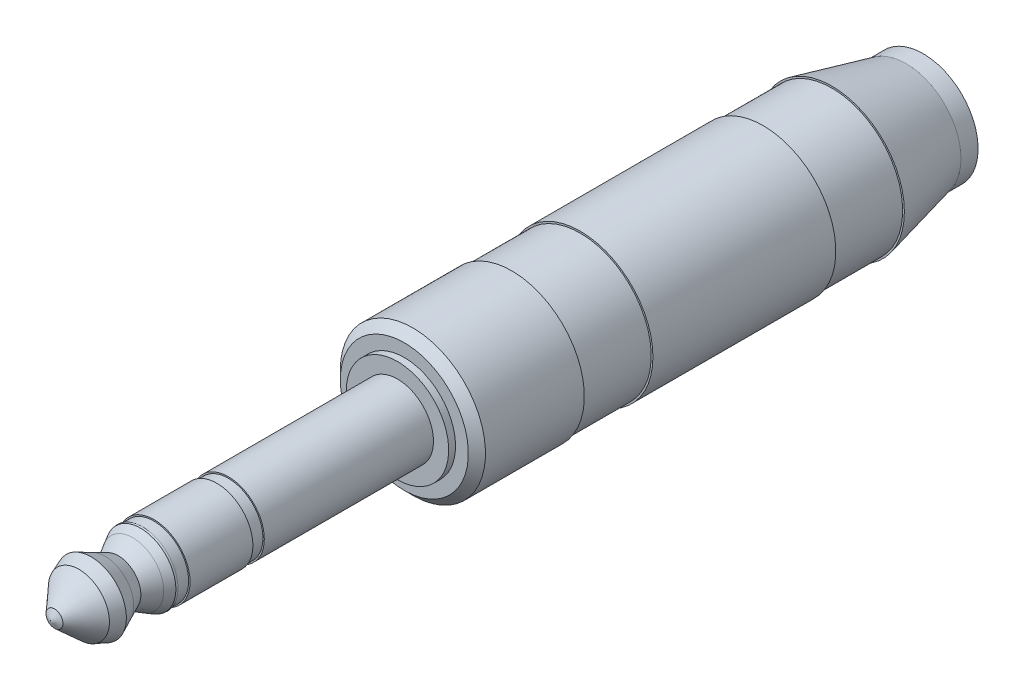
ISO-10303-21;
HEADER;
FILE_DESCRIPTION(('STEP AP214'),'2;1');
FILE_NAME('part.step','',(''),(''),'','','');
FILE_SCHEMA(('AUTOMOTIVE_DESIGN { 1 0 10303 214 1 1 1 1 }'));
ENDSEC;
DATA;
#1=APPLICATION_CONTEXT('core data for automotive mechanical design processes');
#2=APPLICATION_PROTOCOL_DEFINITION('international standard','automotive_design',2000,#1);
#3=PRODUCT_CONTEXT('',#1,'mechanical');
#4=PRODUCT('Part','Part','',(#3));
#5=PRODUCT_RELATED_PRODUCT_CATEGORY('part','',(#4));
#6=PRODUCT_DEFINITION_FORMATION('','',#4);
#7=PRODUCT_DEFINITION_CONTEXT('part definition',#1,'design');
#8=PRODUCT_DEFINITION('design','',#6,#7);
#9=PRODUCT_DEFINITION_SHAPE('','',#8);
#10=(LENGTH_UNIT() NAMED_UNIT(*) SI_UNIT(.MILLI.,.METRE.));
#11=(NAMED_UNIT(*) PLANE_ANGLE_UNIT() SI_UNIT($,.RADIAN.));
#12=(NAMED_UNIT(*) SI_UNIT($,.STERADIAN.) SOLID_ANGLE_UNIT());
#13=UNCERTAINTY_MEASURE_WITH_UNIT(LENGTH_MEASURE(1.E-05),#10,'distance_accuracy_value','');
#14=(GEOMETRIC_REPRESENTATION_CONTEXT(3) GLOBAL_UNCERTAINTY_ASSIGNED_CONTEXT((#13)) GLOBAL_UNIT_ASSIGNED_CONTEXT((#10,
#11,#12)) REPRESENTATION_CONTEXT('',''));
#15=CARTESIAN_POINT('',(0.,0.,0.));
#16=DIRECTION('',(0.,0.,1.));
#17=DIRECTION('',(1.,0.,0.));
#18=AXIS2_PLACEMENT_3D('',#15,#16,#17);
#19=CARTESIAN_POINT('',(0.,0.,-200.));
#20=DIRECTION('',(0.,0.,-1.));
#21=DIRECTION('',(-1.,0.,0.));
#22=AXIS2_PLACEMENT_3D('',#19,#20,#21);
#23=CYLINDRICAL_SURFACE('',#22,6.35);
#24=CARTESIAN_POINT('',(0.,0.,-1.34999999999999));
#25=DIRECTION('',(0.,0.,-1.));
#26=DIRECTION('',(-1.,0.,0.));
#27=AXIS2_PLACEMENT_3D('',#24,#25,#26);
#28=CIRCLE('',#27,6.35);
#29=CARTESIAN_POINT('',(-6.35,0.,-1.34999999999999));
#30=VERTEX_POINT('',#29);
#31=EDGE_CURVE('E159',#30,#30,#28,.T.);
#32=ORIENTED_EDGE('',*,*,#31,.T.);
#33=EDGE_LOOP('',(#32));
#34=FACE_BOUND('',#33,.T.);
#35=CARTESIAN_POINT('',(0.,0.,-10.));
#36=DIRECTION('',(0.,0.,-1.));
#37=DIRECTION('',(-1.,0.,0.));
#38=AXIS2_PLACEMENT_3D('',#35,#36,#37);
#39=CIRCLE('',#38,6.35);
#40=CARTESIAN_POINT('',(-6.35,0.,-10.));
#41=VERTEX_POINT('',#40);
#42=EDGE_CURVE('E109',#41,#41,#39,.T.);
#43=ORIENTED_EDGE('',*,*,#42,.F.);
#44=EDGE_LOOP('',(#43));
#45=FACE_BOUND('',#44,.T.);
#46=ADVANCED_FACE('F45',(#34,#45),#23,.T.);
#47=CARTESIAN_POINT('',(0.,0.,-200.));
#48=DIRECTION('',(0.,0.,-1.));
#49=DIRECTION('',(-1.,0.,0.));
#50=AXIS2_PLACEMENT_3D('',#47,#48,#49);
#51=CYLINDRICAL_SURFACE('',#50,3.15);
#52=CARTESIAN_POINT('',(0.,0.,0.));
#53=DIRECTION('',(0.,0.,-1.));
#54=DIRECTION('',(-1.,0.,0.));
#55=AXIS2_PLACEMENT_3D('',#52,#53,#54);
#56=CIRCLE('',#55,3.15);
#57=CARTESIAN_POINT('',(-3.15,0.,0.));
#58=VERTEX_POINT('',#57);
#59=EDGE_CURVE('E147',#58,#58,#56,.T.);
#60=ORIENTED_EDGE('',*,*,#59,.F.);
#61=EDGE_LOOP('',(#60));
#62=FACE_BOUND('',#61,.T.);
#63=CARTESIAN_POINT('',(0.,0.,14.8));
#64=DIRECTION('',(0.,0.,1.));
#65=DIRECTION('',(1.,0.,0.));
#66=AXIS2_PLACEMENT_3D('',#63,#64,#65);
#67=CIRCLE('',#66,3.15);
#68=CARTESIAN_POINT('',(3.15,0.,14.8));
#69=VERTEX_POINT('',#68);
#70=EDGE_CURVE('E123',#69,#69,#67,.T.);
#71=ORIENTED_EDGE('',*,*,#70,.F.);
#72=EDGE_LOOP('',(#71));
#73=FACE_BOUND('',#72,.T.);
#74=ADVANCED_FACE('F72',(#62,#73),#51,.T.);
#75=CARTESIAN_POINT('',(3.15,0.,0.));
#76=DIRECTION('',(0.,0.,-1.));
#77=DIRECTION('',(-1.,0.,0.));
#78=AXIS2_PLACEMENT_3D('',#75,#76,#77);
#79=PLANE('',#78);
#80=CARTESIAN_POINT('',(0.,0.,0.));
#81=DIRECTION('',(0.,0.,-1.));
#82=DIRECTION('',(-1.,0.,0.));
#83=AXIS2_PLACEMENT_3D('',#80,#81,#82);
#84=CIRCLE('',#83,4.48);
#85=CARTESIAN_POINT('',(-4.48,0.,0.));
#86=VERTEX_POINT('',#85);
#87=EDGE_CURVE('E150',#86,#86,#84,.T.);
#88=ORIENTED_EDGE('',*,*,#87,.F.);
#89=EDGE_LOOP('',(#88));
#90=FACE_BOUND('',#89,.T.);
#91=ORIENTED_EDGE('',*,*,#59,.T.);
#92=EDGE_LOOP('',(#91));
#93=FACE_BOUND('',#92,.T.);
#94=ADVANCED_FACE('F79',(#90,#93),#79,.F.);
#95=CARTESIAN_POINT('',(0.,0.,-200.));
#96=DIRECTION('',(0.,0.,-1.));
#97=DIRECTION('',(-1.,0.,0.));
#98=AXIS2_PLACEMENT_3D('',#95,#96,#97);
#99=CYLINDRICAL_SURFACE('',#98,4.48);
#100=CARTESIAN_POINT('',(0.,0.,-0.599999999999989));
#101=DIRECTION('',(0.,0.,-1.));
#102=DIRECTION('',(-1.,0.,0.));
#103=AXIS2_PLACEMENT_3D('',#100,#101,#102);
#104=CIRCLE('',#103,4.48);
#105=CARTESIAN_POINT('',(-4.48,0.,-0.599999999999989));
#106=VERTEX_POINT('',#105);
#107=EDGE_CURVE('E153',#106,#106,#104,.T.);
#108=ORIENTED_EDGE('',*,*,#107,.F.);
#109=EDGE_LOOP('',(#108));
#110=FACE_BOUND('',#109,.T.);
#111=ORIENTED_EDGE('',*,*,#87,.T.);
#112=EDGE_LOOP('',(#111));
#113=FACE_BOUND('',#112,.T.);
#114=ADVANCED_FACE('F548',(#110,#113),#99,.T.);
#115=CARTESIAN_POINT('',(4.48,0.,-0.6));
#116=DIRECTION('',(0.,0.,-1.));
#117=DIRECTION('',(-1.,0.,0.));
#118=AXIS2_PLACEMENT_3D('',#115,#116,#117);
#119=PLANE('',#118);
#120=CARTESIAN_POINT('',(0.,0.,-0.599999999999989));
#121=DIRECTION('',(0.,0.,-1.));
#122=DIRECTION('',(-1.,0.,0.));
#123=AXIS2_PLACEMENT_3D('',#120,#121,#122);
#124=CIRCLE('',#123,5.6);
#125=CARTESIAN_POINT('',(-5.6,0.,-0.599999999999989));
#126=VERTEX_POINT('',#125);
#127=EDGE_CURVE('E156',#126,#126,#124,.T.);
#128=ORIENTED_EDGE('',*,*,#127,.F.);
#129=EDGE_LOOP('',(#128));
#130=FACE_BOUND('',#129,.T.);
#131=ORIENTED_EDGE('',*,*,#107,.T.);
#132=EDGE_LOOP('',(#131));
#133=FACE_BOUND('',#132,.T.);
#134=ADVANCED_FACE('F539',(#130,#133),#119,.F.);
#135=CARTESIAN_POINT('',(0.,0.,-0.599999999999989));
#136=DIRECTION('',(0.,0.,-1.));
#137=DIRECTION('',(-1.,0.,0.));
#138=AXIS2_PLACEMENT_3D('',#135,#136,#137);
#139=CONICAL_SURFACE('',#138,5.6,0.785398163397448);
#140=ORIENTED_EDGE('',*,*,#31,.F.);
#141=EDGE_LOOP('',(#140));
#142=FACE_BOUND('',#141,.T.);
#143=ORIENTED_EDGE('',*,*,#127,.T.);
#144=EDGE_LOOP('',(#143));
#145=FACE_BOUND('',#144,.T.);
#146=ADVANCED_FACE('F242',(#142,#145),#139,.T.);
#147=CARTESIAN_POINT('',(3.03,0.,14.8));
#148=DIRECTION('',(0.,0.,1.));
#149=DIRECTION('',(1.,0.,0.));
#150=AXIS2_PLACEMENT_3D('',#147,#148,#149);
#151=PLANE('',#150);
#152=CARTESIAN_POINT('',(0.,0.,14.8));
#153=DIRECTION('',(0.,0.,-1.));
#154=DIRECTION('',(-1.,0.,0.));
#155=AXIS2_PLACEMENT_3D('',#152,#153,#154);
#156=CIRCLE('',#155,3.03);
#157=CARTESIAN_POINT('',(-3.03,0.,14.8));
#158=VERTEX_POINT('',#157);
#159=EDGE_CURVE('E166',#158,#158,#156,.T.);
#160=ORIENTED_EDGE('',*,*,#159,.T.);
#161=EDGE_LOOP('',(#160));
#162=FACE_BOUND('',#161,.T.);
#163=ORIENTED_EDGE('',*,*,#70,.T.);
#164=EDGE_LOOP('',(#163));
#165=FACE_BOUND('',#164,.T.);
#166=ADVANCED_FACE('F238',(#162,#165),#151,.T.);
#167=CARTESIAN_POINT('',(3.4,0.,15.8));
#168=DIRECTION('',(0.,0.,-1.));
#169=DIRECTION('',(-1.,0.,0.));
#170=AXIS2_PLACEMENT_3D('',#167,#168,#169);
#171=PLANE('',#170);
#172=CARTESIAN_POINT('',(0.,0.,15.8));
#173=DIRECTION('',(0.,0.,-1.));
#174=DIRECTION('',(-1.,0.,0.));
#175=AXIS2_PLACEMENT_3D('',#172,#173,#174);
#176=CIRCLE('',#175,3.03);
#177=CARTESIAN_POINT('',(-3.03,0.,15.8));
#178=VERTEX_POINT('',#177);
#179=EDGE_CURVE('E112',#178,#178,#176,.T.);
#180=ORIENTED_EDGE('',*,*,#179,.F.);
#181=EDGE_LOOP('',(#180));
#182=FACE_BOUND('',#181,.T.);
#183=CARTESIAN_POINT('',(0.,0.,15.8));
#184=DIRECTION('',(0.,0.,-1.));
#185=DIRECTION('',(-1.,0.,0.));
#186=AXIS2_PLACEMENT_3D('',#183,#184,#185);
#187=CIRCLE('',#186,3.15);
#188=CARTESIAN_POINT('',(-3.15,0.,15.8));
#189=VERTEX_POINT('',#188);
#190=EDGE_CURVE('E126',#189,#189,#187,.T.);
#191=ORIENTED_EDGE('',*,*,#190,.T.);
#192=EDGE_LOOP('',(#191));
#193=FACE_BOUND('',#192,.T.);
#194=ADVANCED_FACE('F234',(#182,#193),#171,.T.);
#195=CARTESIAN_POINT('',(0.,0.,-200.));
#196=DIRECTION('',(0.,0.,-1.));
#197=DIRECTION('',(-1.,0.,0.));
#198=AXIS2_PLACEMENT_3D('',#195,#196,#197);
#199=CYLINDRICAL_SURFACE('',#198,3.03);
#200=ORIENTED_EDGE('',*,*,#179,.T.);
#201=EDGE_LOOP('',(#200));
#202=FACE_BOUND('',#201,.T.);
#203=ORIENTED_EDGE('',*,*,#159,.F.);
#204=EDGE_LOOP('',(#203));
#205=FACE_BOUND('',#204,.T.);
#206=ADVANCED_FACE('F237',(#202,#205),#199,.T.);
#207=ORIENTED_EDGE('',*,*,#190,.F.);
#208=EDGE_LOOP('',(#207));
#209=FACE_BOUND('',#208,.T.);
#210=CARTESIAN_POINT('',(0.,0.,21.3));
#211=DIRECTION('',(0.,0.,1.));
#212=DIRECTION('',(1.,0.,0.));
#213=AXIS2_PLACEMENT_3D('',#210,#211,#212);
#214=CIRCLE('',#213,3.15);
#215=CARTESIAN_POINT('',(3.15,0.,21.3));
#216=VERTEX_POINT('',#215);
#217=EDGE_CURVE('E120',#216,#216,#214,.T.);
#218=ORIENTED_EDGE('',*,*,#217,.F.);
#219=EDGE_LOOP('',(#218));
#220=FACE_BOUND('',#219,.T.);
#221=ADVANCED_FACE('F82',(#209,#220),#51,.T.);
#222=CARTESIAN_POINT('',(3.4,0.,22.3));
#223=DIRECTION('',(0.,0.,-1.));
#224=DIRECTION('',(-1.,0.,0.));
#225=AXIS2_PLACEMENT_3D('',#222,#223,#224);
#226=PLANE('',#225);
#227=CARTESIAN_POINT('',(0.,0.,22.3));
#228=DIRECTION('',(0.,0.,-1.));
#229=DIRECTION('',(-1.,0.,0.));
#230=AXIS2_PLACEMENT_3D('',#227,#228,#229);
#231=CIRCLE('',#230,3.03);
#232=CARTESIAN_POINT('',(-3.03,0.,22.3));
#233=VERTEX_POINT('',#232);
#234=EDGE_CURVE('E169',#233,#233,#231,.T.);
#235=ORIENTED_EDGE('',*,*,#234,.F.);
#236=EDGE_LOOP('',(#235));
#237=FACE_BOUND('',#236,.T.);
#238=CARTESIAN_POINT('',(0.,0.,22.3));
#239=DIRECTION('',(0.,0.,-1.));
#240=DIRECTION('',(-1.,0.,0.));
#241=AXIS2_PLACEMENT_3D('',#238,#239,#240);
#242=CIRCLE('',#241,3.09888888888889);
#243=CARTESIAN_POINT('',(-3.09888888888889,0.,22.3));
#244=VERTEX_POINT('',#243);
#245=EDGE_CURVE('E116',#244,#244,#242,.T.);
#246=ORIENTED_EDGE('',*,*,#245,.T.);
#247=EDGE_LOOP('',(#246));
#248=FACE_BOUND('',#247,.T.);
#249=ADVANCED_FACE('F227',(#237,#248),#226,.T.);
#250=CARTESIAN_POINT('',(3.03,0.,21.3));
#251=DIRECTION('',(0.,0.,1.));
#252=DIRECTION('',(1.,0.,0.));
#253=AXIS2_PLACEMENT_3D('',#250,#251,#252);
#254=PLANE('',#253);
#255=CARTESIAN_POINT('',(0.,0.,21.3));
#256=DIRECTION('',(0.,0.,-1.));
#257=DIRECTION('',(-1.,0.,0.));
#258=AXIS2_PLACEMENT_3D('',#255,#256,#257);
#259=CIRCLE('',#258,3.03);
#260=CARTESIAN_POINT('',(-3.03,0.,21.3));
#261=VERTEX_POINT('',#260);
#262=EDGE_CURVE('E128',#261,#261,#259,.T.);
#263=ORIENTED_EDGE('',*,*,#262,.T.);
#264=EDGE_LOOP('',(#263));
#265=FACE_BOUND('',#264,.T.);
#266=ORIENTED_EDGE('',*,*,#217,.T.);
#267=EDGE_LOOP('',(#266));
#268=FACE_BOUND('',#267,.T.);
#269=ADVANCED_FACE('F67',(#265,#268),#254,.T.);
#270=CARTESIAN_POINT('',(0.,0.,-200.));
#271=DIRECTION('',(0.,0.,-1.));
#272=DIRECTION('',(-1.,0.,0.));
#273=AXIS2_PLACEMENT_3D('',#270,#271,#272);
#274=CYLINDRICAL_SURFACE('',#273,3.03);
#275=ORIENTED_EDGE('',*,*,#234,.T.);
#276=EDGE_LOOP('',(#275));
#277=FACE_BOUND('',#276,.T.);
#278=ORIENTED_EDGE('',*,*,#262,.F.);
#279=EDGE_LOOP('',(#278));
#280=FACE_BOUND('',#279,.T.);
#281=ADVANCED_FACE('F59',(#277,#280),#274,.T.);
#282=CARTESIAN_POINT('',(0.,0.,30.34));
#283=DIRECTION('',(0.,0.,-1.));
#284=DIRECTION('',(-1.,0.,0.));
#285=AXIS2_PLACEMENT_3D('',#282,#283,#284);
#286=CONICAL_SURFACE('',#285,0.,1.15131886503954);
#287=CARTESIAN_POINT('',(0.,0.,30.01));
#288=DIRECTION('',(0.,0.,-1.));
#289=DIRECTION('',(-1.,0.,0.));
#290=AXIS2_PLACEMENT_3D('',#287,#288,#289);
#291=CIRCLE('',#290,0.74);
#292=CARTESIAN_POINT('',(-0.739999999999998,0.,30.01));
#293=VERTEX_POINT('',#292);
#294=EDGE_CURVE('E11',#293,#293,#291,.T.);
#295=ORIENTED_EDGE('',*,*,#294,.F.);
#296=EDGE_LOOP('',(#295));
#297=FACE_BOUND('',#296,.T.);
#298=CARTESIAN_POINT('',(0.,0.,30.34));
#299=VERTEX_POINT('',#298);
#300=VERTEX_LOOP('',#299);
#301=FACE_BOUND('',#300,.T.);
#302=ADVANCED_FACE('F47',(#297,#301),#286,.T.);
#303=CARTESIAN_POINT('',(0.,0.,30.01));
#304=DIRECTION('',(0.,0.,-1.));
#305=DIRECTION('',(-1.,0.,0.));
#306=AXIS2_PLACEMENT_3D('',#303,#304,#305);
#307=CONICAL_SURFACE('',#306,0.74,0.733846826981431);
#308=CARTESIAN_POINT('',(0.,0.,27.87));
#309=DIRECTION('',(0.,0.,-1.));
#310=DIRECTION('',(-1.,0.,0.));
#311=AXIS2_PLACEMENT_3D('',#308,#309,#310);
#312=CIRCLE('',#311,2.67);
#313=CARTESIAN_POINT('',(-2.67,0.,27.87));
#314=VERTEX_POINT('',#313);
#315=EDGE_CURVE('E53',#314,#314,#312,.T.);
#316=CARTESIAN_POINT('',(-2.67,0.,27.87));
#317=CARTESIAN_POINT('',(-2.64989583333333,0.,27.8922916666667));
#318=CARTESIAN_POINT('',(-2.62979166666666,0.,27.9145833333333));
#319=CARTESIAN_POINT('',(-2.58958333333333,0.,27.9591666666667));
#320=CARTESIAN_POINT('',(-2.56947916666667,0.,27.9814583333333));
#321=CARTESIAN_POINT('',(-2.52927083333333,0.,28.0260416666667));
#322=CARTESIAN_POINT('',(-2.50916666666666,0.,28.0483333333333));
#323=CARTESIAN_POINT('',(-2.46895833333333,0.,28.0929166666667));
#324=CARTESIAN_POINT('',(-2.44885416666667,0.,28.1152083333333));
#325=CARTESIAN_POINT('',(-2.40864583333333,0.,28.1597916666667));
#326=CARTESIAN_POINT('',(-2.38854166666667,0.,28.1820833333333));
#327=CARTESIAN_POINT('',(-2.34833333333333,0.,28.2266666666667));
#328=CARTESIAN_POINT('',(-2.32822916666667,0.,28.2489583333333));
#329=CARTESIAN_POINT('',(-2.28802083333333,0.,28.2935416666667));
#330=CARTESIAN_POINT('',(-2.26791666666667,0.,28.3158333333333));
#331=CARTESIAN_POINT('',(-2.22770833333333,0.,28.3604166666667));
#332=CARTESIAN_POINT('',(-2.20760416666666,0.,28.3827083333333));
#333=CARTESIAN_POINT('',(-2.16739583333333,0.,28.4272916666667));
#334=CARTESIAN_POINT('',(-2.14729166666667,0.,28.4495833333333));
#335=CARTESIAN_POINT('',(-2.10708333333333,0.,28.4941666666667));
#336=CARTESIAN_POINT('',(-2.08697916666667,0.,28.5164583333333));
#337=CARTESIAN_POINT('',(-2.04677083333333,0.,28.5610416666667));
#338=CARTESIAN_POINT('',(-2.02666666666667,0.,28.5833333333333));
#339=CARTESIAN_POINT('',(-1.98645833333333,0.,28.6279166666667));
#340=CARTESIAN_POINT('',(-1.96635416666667,0.,28.6502083333333));
#341=CARTESIAN_POINT('',(-1.92614583333333,0.,28.6947916666667));
#342=CARTESIAN_POINT('',(-1.90604166666667,0.,28.7170833333333));
#343=CARTESIAN_POINT('',(-1.86583333333333,0.,28.7616666666667));
#344=CARTESIAN_POINT('',(-1.84572916666667,0.,28.7839583333333));
#345=CARTESIAN_POINT('',(-1.80552083333333,0.,28.8285416666667));
#346=CARTESIAN_POINT('',(-1.78541666666667,0.,28.8508333333333));
#347=CARTESIAN_POINT('',(-1.74520833333333,0.,28.8954166666667));
#348=CARTESIAN_POINT('',(-1.72510416666666,0.,28.9177083333333));
#349=CARTESIAN_POINT('',(-1.68489583333333,0.,28.9622916666667));
#350=CARTESIAN_POINT('',(-1.66479166666667,0.,28.9845833333333));
#351=CARTESIAN_POINT('',(-1.62458333333333,0.,29.0291666666667));
#352=CARTESIAN_POINT('',(-1.60447916666667,0.,29.0514583333333));
#353=CARTESIAN_POINT('',(-1.56427083333333,0.,29.0960416666667));
#354=CARTESIAN_POINT('',(-1.54416666666667,0.,29.1183333333333));
#355=CARTESIAN_POINT('',(-1.50395833333333,0.,29.1629166666667));
#356=CARTESIAN_POINT('',(-1.48385416666667,0.,29.1852083333333));
#357=CARTESIAN_POINT('',(-1.44364583333333,0.,29.2297916666667));
#358=CARTESIAN_POINT('',(-1.42354166666666,0.,29.2520833333333));
#359=CARTESIAN_POINT('',(-1.38333333333333,0.,29.2966666666667));
#360=CARTESIAN_POINT('',(-1.36322916666666,0.,29.3189583333333));
#361=CARTESIAN_POINT('',(-1.32302083333333,0.,29.3635416666667));
#362=CARTESIAN_POINT('',(-1.30291666666667,0.,29.3858333333333));
#363=CARTESIAN_POINT('',(-1.26270833333333,0.,29.4304166666667));
#364=CARTESIAN_POINT('',(-1.24260416666666,0.,29.4527083333333));
#365=CARTESIAN_POINT('',(-1.20239583333333,0.,29.4972916666667));
#366=CARTESIAN_POINT('',(-1.18229166666666,0.,29.5195833333333));
#367=CARTESIAN_POINT('',(-1.14208333333333,0.,29.5641666666667));
#368=CARTESIAN_POINT('',(-1.12197916666667,0.,29.5864583333333));
#369=CARTESIAN_POINT('',(-1.08177083333333,0.,29.6310416666667));
#370=CARTESIAN_POINT('',(-1.06166666666666,0.,29.6533333333333));
#371=CARTESIAN_POINT('',(-1.02145833333333,0.,29.6979166666667));
#372=CARTESIAN_POINT('',(-1.00135416666667,0.,29.7202083333333));
#373=CARTESIAN_POINT('',(-0.961145833333332,0.,29.7647916666667));
#374=CARTESIAN_POINT('',(-0.941041666666665,0.,29.7870833333333));
#375=CARTESIAN_POINT('',(-0.900833333333331,0.,29.8316666666667));
#376=CARTESIAN_POINT('',(-0.880729166666665,0.,29.8539583333333));
#377=CARTESIAN_POINT('',(-0.840520833333332,0.,29.8985416666667));
#378=CARTESIAN_POINT('',(-0.820416666666665,0.,29.9208333333333));
#379=CARTESIAN_POINT('',(-0.780208333333332,0.,29.9654166666667));
#380=CARTESIAN_POINT('',(-0.760104166666666,0.,29.9877083333333));
#381=CARTESIAN_POINT('',(-0.739999999999998,0.,30.01));
#382=B_SPLINE_CURVE_WITH_KNOTS('',3,(#316,#317,#318,#319,#320,#321,#322,#323,#324,#325,#326,
#327,#328,#329,#330,#331,#332,#333,#334,#335,#336,#337,#338,#339,#340,#341,#342,#343,#344,#345,
#346,#347,#348,#349,#350,#351,#352,#353,#354,#355,#356,#357,#358,#359,#360,#361,#362,#363,#364,
#365,#366,#367,#368,#369,#370,#371,#372,#373,#374,#375,#376,#377,#378,#379,#380,#381),
.UNSPECIFIED.,.F.,.F.,(4,2,2,2,2,2,2,2,2,2,2,2,2,2,2,2,2,2,2,2,2,2,2,2,2,2,2,2,2,2,2,2,4),(0.,
0.0900547793359696,0.180109558671939,0.270164338007908,0.360219117343877,0.450273896679844,
0.540328676015813,0.630383455351783,0.72043823468775,0.810493014023719,0.900547793359688,
0.990602572695657,1.08065735203163,1.17071213136759,1.26076691070356,1.35082169003953,
1.4408764693755,1.53093124871147,1.62098602804744,1.71104080738341,1.80109558671938,
1.89115036605534,1.98120514539131,2.07125992472728,2.16131470406325,2.25136948339922,
2.34142426273519,2.43147904207116,2.52153382140713,2.61158860074309,2.70164338007906,
2.79169815941503,2.881752938751),.UNSPECIFIED.);
#383=EDGE_CURVE('BSEAM58',#314,#293,#382,.T.);
#384=ORIENTED_EDGE('',*,*,#315,.F.);
#385=ORIENTED_EDGE('',*,*,#294,.T.);
#386=ORIENTED_EDGE('',*,*,#383,.T.);
#387=ORIENTED_EDGE('',*,*,#383,.F.);
#388=EDGE_LOOP('',(#384,#386,#385,#387));
#389=FACE_BOUND('',#388,.T.);
#390=ADVANCED_FACE('F58',(#389),#307,.T.);
#391=CARTESIAN_POINT('',(0.,0.,27.87));
#392=DIRECTION('',(0.,0.,-1.));
#393=DIRECTION('',(-1.,0.,0.));
#394=AXIS2_PLACEMENT_3D('',#391,#392,#393);
#395=CONICAL_SURFACE('',#394,2.67,0.365920701642083);
#396=CARTESIAN_POINT('',(0.,0.,26.8));
#397=DIRECTION('',(0.,0.,-1.));
#398=DIRECTION('',(-1.,0.,0.));
#399=AXIS2_PLACEMENT_3D('',#396,#397,#398);
#400=CIRCLE('',#399,3.08);
#401=CARTESIAN_POINT('',(-3.08,0.,26.8));
#402=VERTEX_POINT('',#401);
#403=EDGE_CURVE('E132',#402,#402,#400,.T.);
#404=ORIENTED_EDGE('',*,*,#403,.F.);
#405=EDGE_LOOP('',(#404));
#406=FACE_BOUND('',#405,.T.);
#407=ORIENTED_EDGE('',*,*,#315,.T.);
#408=EDGE_LOOP('',(#407));
#409=FACE_BOUND('',#408,.T.);
#410=ADVANCED_FACE('F65',(#406,#409),#395,.T.);
#411=CARTESIAN_POINT('',(0.,0.,26.8));
#412=DIRECTION('',(0.,0.,1.));
#413=DIRECTION('',(1.,0.,0.));
#414=AXIS2_PLACEMENT_3D('',#411,#412,#413);
#415=CONICAL_SURFACE('',#414,3.08,0.43707579145684);
#416=CARTESIAN_POINT('',(0.,0.,25.58));
#417=DIRECTION('',(0.,0.,-1.));
#418=DIRECTION('',(-1.,0.,0.));
#419=AXIS2_PLACEMENT_3D('',#416,#417,#418);
#420=CIRCLE('',#419,2.51);
#421=CARTESIAN_POINT('',(-2.51,0.,25.58));
#422=VERTEX_POINT('',#421);
#423=EDGE_CURVE('E135',#422,#422,#420,.T.);
#424=ORIENTED_EDGE('',*,*,#423,.F.);
#425=EDGE_LOOP('',(#424));
#426=FACE_BOUND('',#425,.T.);
#427=ORIENTED_EDGE('',*,*,#403,.T.);
#428=EDGE_LOOP('',(#427));
#429=FACE_BOUND('',#428,.T.);
#430=ADVANCED_FACE('F282',(#426,#429),#415,.T.);
#431=CARTESIAN_POINT('',(0.,0.,25.58));
#432=DIRECTION('',(0.,0.,1.));
#433=DIRECTION('',(1.,0.,0.));
#434=AXIS2_PLACEMENT_3D('',#431,#432,#433);
#435=CONICAL_SURFACE('',#434,2.51,0.431856203646335);
#436=CARTESIAN_POINT('',(0.,0.,24.43));
#437=DIRECTION('',(0.,0.,-1.));
#438=DIRECTION('',(-1.,0.,0.));
#439=AXIS2_PLACEMENT_3D('',#436,#437,#438);
#440=CIRCLE('',#439,1.98);
#441=CARTESIAN_POINT('',(-1.98,0.,24.43));
#442=VERTEX_POINT('',#441);
#443=EDGE_CURVE('E138',#442,#442,#440,.T.);
#444=ORIENTED_EDGE('',*,*,#443,.F.);
#445=EDGE_LOOP('',(#444));
#446=FACE_BOUND('',#445,.T.);
#447=ORIENTED_EDGE('',*,*,#423,.T.);
#448=EDGE_LOOP('',(#447));
#449=FACE_BOUND('',#448,.T.);
#450=ADVANCED_FACE('F278',(#446,#449),#435,.T.);
#451=CARTESIAN_POINT('',(0.,0.,24.43));
#452=DIRECTION('',(0.,0.,-1.));
#453=DIRECTION('',(-1.,0.,0.));
#454=AXIS2_PLACEMENT_3D('',#451,#452,#453);
#455=CONICAL_SURFACE('',#454,1.98,0.512389460310737);
#456=CARTESIAN_POINT('',(0.,0.,23.15));
#457=DIRECTION('',(0.,0.,-1.));
#458=DIRECTION('',(-1.,0.,0.));
#459=AXIS2_PLACEMENT_3D('',#456,#457,#458);
#460=CIRCLE('',#459,2.7);
#461=CARTESIAN_POINT('',(-2.7,0.,23.15));
#462=VERTEX_POINT('',#461);
#463=EDGE_CURVE('E141',#462,#462,#460,.T.);
#464=ORIENTED_EDGE('',*,*,#463,.F.);
#465=EDGE_LOOP('',(#464));
#466=FACE_BOUND('',#465,.T.);
#467=ORIENTED_EDGE('',*,*,#443,.T.);
#468=EDGE_LOOP('',(#467));
#469=FACE_BOUND('',#468,.T.);
#470=ADVANCED_FACE('F274',(#466,#469),#455,.T.);
#471=CARTESIAN_POINT('',(0.,0.,23.15));
#472=DIRECTION('',(0.,0.,-1.));
#473=DIRECTION('',(-1.,0.,0.));
#474=AXIS2_PLACEMENT_3D('',#471,#472,#473);
#475=CONICAL_SURFACE('',#474,2.7,0.509592264808917);
#476=CARTESIAN_POINT('',(0.,0.,22.47));
#477=DIRECTION('',(0.,0.,-1.));
#478=DIRECTION('',(-1.,0.,0.));
#479=AXIS2_PLACEMENT_3D('',#476,#477,#478);
#480=CIRCLE('',#479,3.08);
#481=CARTESIAN_POINT('',(-3.08,0.,22.47));
#482=VERTEX_POINT('',#481);
#483=EDGE_CURVE('E144',#482,#482,#480,.T.);
#484=ORIENTED_EDGE('',*,*,#483,.F.);
#485=EDGE_LOOP('',(#484));
#486=FACE_BOUND('',#485,.T.);
#487=ORIENTED_EDGE('',*,*,#463,.T.);
#488=EDGE_LOOP('',(#487));
#489=FACE_BOUND('',#488,.T.);
#490=ADVANCED_FACE('F270',(#486,#489),#475,.T.);
#491=CARTESIAN_POINT('',(0.,0.,22.47));
#492=DIRECTION('',(0.,0.,-1.));
#493=DIRECTION('',(-1.,0.,0.));
#494=AXIS2_PLACEMENT_3D('',#491,#492,#493);
#495=CONICAL_SURFACE('',#494,3.08,0.110657221173897);
#496=ORIENTED_EDGE('',*,*,#483,.T.);
#497=EDGE_LOOP('',(#496));
#498=FACE_BOUND('',#497,.T.);
#499=ORIENTED_EDGE('',*,*,#245,.F.);
#500=EDGE_LOOP('',(#499));
#501=FACE_BOUND('',#500,.T.);
#502=ADVANCED_FACE('F266',(#498,#501),#495,.T.);
#503=CARTESIAN_POINT('',(6.2,0.,-10.));
#504=DIRECTION('',(0.,0.,-1.));
#505=DIRECTION('',(-1.,0.,0.));
#506=AXIS2_PLACEMENT_3D('',#503,#504,#505);
#507=PLANE('',#506);
#508=CARTESIAN_POINT('',(0.,0.,-10.));
#509=DIRECTION('',(0.,0.,-1.));
#510=DIRECTION('',(-1.,0.,0.));
#511=AXIS2_PLACEMENT_3D('',#508,#509,#510);
#512=CIRCLE('',#511,6.2);
#513=CARTESIAN_POINT('',(-6.2,0.,-10.));
#514=VERTEX_POINT('',#513);
#515=EDGE_CURVE('E178',#514,#514,#512,.T.);
#516=ORIENTED_EDGE('',*,*,#515,.F.);
#517=EDGE_LOOP('',(#516));
#518=FACE_BOUND('',#517,.T.);
#519=ORIENTED_EDGE('',*,*,#42,.T.);
#520=EDGE_LOOP('',(#519));
#521=FACE_BOUND('',#520,.T.);
#522=ADVANCED_FACE('F269',(#518,#521),#507,.T.);
#523=CARTESIAN_POINT('',(6.6,0.,-16.));
#524=DIRECTION('',(0.,0.,1.));
#525=DIRECTION('',(1.,0.,0.));
#526=AXIS2_PLACEMENT_3D('',#523,#524,#525);
#527=PLANE('',#526);
#528=CARTESIAN_POINT('',(0.,0.,-16.));
#529=DIRECTION('',(0.,0.,-1.));
#530=DIRECTION('',(-1.,0.,0.));
#531=AXIS2_PLACEMENT_3D('',#528,#529,#530);
#532=CIRCLE('',#531,6.2);
#533=CARTESIAN_POINT('',(-6.2,0.,-16.));
#534=VERTEX_POINT('',#533);
#535=EDGE_CURVE('E182',#534,#534,#532,.T.);
#536=ORIENTED_EDGE('',*,*,#535,.T.);
#537=EDGE_LOOP('',(#536));
#538=FACE_BOUND('',#537,.T.);
#539=CARTESIAN_POINT('',(0.,0.,-16.));
#540=DIRECTION('',(0.,0.,1.));
#541=DIRECTION('',(1.,0.,0.));
#542=AXIS2_PLACEMENT_3D('',#539,#540,#541);
#543=CIRCLE('',#542,6.35);
#544=CARTESIAN_POINT('',(6.35,0.,-16.));
#545=VERTEX_POINT('',#544);
#546=EDGE_CURVE('E107',#545,#545,#543,.T.);
#547=ORIENTED_EDGE('',*,*,#546,.T.);
#548=EDGE_LOOP('',(#547));
#549=FACE_BOUND('',#548,.T.);
#550=ADVANCED_FACE('F98',(#538,#549),#527,.T.);
#551=CARTESIAN_POINT('',(0.,0.,-200.));
#552=DIRECTION('',(0.,0.,-1.));
#553=DIRECTION('',(-1.,0.,0.));
#554=AXIS2_PLACEMENT_3D('',#551,#552,#553);
#555=CYLINDRICAL_SURFACE('',#554,6.2);
#556=ORIENTED_EDGE('',*,*,#515,.T.);
#557=EDGE_LOOP('',(#556));
#558=FACE_BOUND('',#557,.T.);
#559=ORIENTED_EDGE('',*,*,#535,.F.);
#560=EDGE_LOOP('',(#559));
#561=FACE_BOUND('',#560,.T.);
#562=ADVANCED_FACE('F89',(#558,#561),#555,.T.);
#563=CARTESIAN_POINT('',(0.,0.,-32.));
#564=DIRECTION('',(0.,0.,-1.));
#565=DIRECTION('',(-1.,0.,0.));
#566=AXIS2_PLACEMENT_3D('',#563,#564,#565);
#567=CIRCLE('',#566,6.35);
#568=CARTESIAN_POINT('',(-6.35,0.,-32.));
#569=VERTEX_POINT('',#568);
#570=EDGE_CURVE('E104',#569,#569,#567,.T.);
#571=ORIENTED_EDGE('',*,*,#570,.F.);
#572=EDGE_LOOP('',(#571));
#573=FACE_BOUND('',#572,.T.);
#574=ORIENTED_EDGE('',*,*,#546,.F.);
#575=EDGE_LOOP('',(#574));
#576=FACE_BOUND('',#575,.T.);
#577=ADVANCED_FACE('F75',(#573,#576),#23,.T.);
#578=CARTESIAN_POINT('',(6.2,0.,-32.));
#579=DIRECTION('',(0.,0.,-1.));
#580=DIRECTION('',(-1.,0.,0.));
#581=AXIS2_PLACEMENT_3D('',#578,#579,#580);
#582=PLANE('',#581);
#583=CARTESIAN_POINT('',(0.,0.,-32.));
#584=DIRECTION('',(0.,0.,-1.));
#585=DIRECTION('',(-1.,0.,0.));
#586=AXIS2_PLACEMENT_3D('',#583,#584,#585);
#587=CIRCLE('',#586,6.2);
#588=CARTESIAN_POINT('',(-6.2,0.,-32.));
#589=VERTEX_POINT('',#588);
#590=EDGE_CURVE('E179',#589,#589,#587,.T.);
#591=ORIENTED_EDGE('',*,*,#590,.F.);
#592=EDGE_LOOP('',(#591));
#593=FACE_BOUND('',#592,.T.);
#594=ORIENTED_EDGE('',*,*,#570,.T.);
#595=EDGE_LOOP('',(#594));
#596=FACE_BOUND('',#595,.T.);
#597=ADVANCED_FACE('F88',(#593,#596),#582,.T.);
#598=CARTESIAN_POINT('',(6.6,0.,-38.));
#599=DIRECTION('',(0.,0.,1.));
#600=DIRECTION('',(1.,0.,0.));
#601=AXIS2_PLACEMENT_3D('',#598,#599,#600);
#602=PLANE('',#601);
#603=CARTESIAN_POINT('',(0.,0.,-38.));
#604=DIRECTION('',(0.,0.,-1.));
#605=DIRECTION('',(-1.,0.,0.));
#606=AXIS2_PLACEMENT_3D('',#603,#604,#605);
#607=CIRCLE('',#606,6.2);
#608=CARTESIAN_POINT('',(-6.2,0.,-38.));
#609=VERTEX_POINT('',#608);
#610=EDGE_CURVE('E183',#609,#609,#607,.T.);
#611=ORIENTED_EDGE('',*,*,#610,.T.);
#612=EDGE_LOOP('',(#611));
#613=FACE_BOUND('',#612,.T.);
#614=CARTESIAN_POINT('',(0.,0.,-38.));
#615=DIRECTION('',(0.,0.,1.));
#616=DIRECTION('',(1.,0.,0.));
#617=AXIS2_PLACEMENT_3D('',#614,#615,#616);
#618=CIRCLE('',#617,6.35);
#619=CARTESIAN_POINT('',(6.35,0.,-38.));
#620=VERTEX_POINT('',#619);
#621=EDGE_CURVE('E113',#620,#620,#618,.T.);
#622=ORIENTED_EDGE('',*,*,#621,.T.);
#623=EDGE_LOOP('',(#622));
#624=FACE_BOUND('',#623,.T.);
#625=ADVANCED_FACE('F95',(#613,#624),#602,.T.);
#626=CARTESIAN_POINT('',(0.,0.,-200.));
#627=DIRECTION('',(0.,0.,-1.));
#628=DIRECTION('',(-1.,0.,0.));
#629=AXIS2_PLACEMENT_3D('',#626,#627,#628);
#630=CYLINDRICAL_SURFACE('',#629,6.2);
#631=ORIENTED_EDGE('',*,*,#590,.T.);
#632=EDGE_LOOP('',(#631));
#633=FACE_BOUND('',#632,.T.);
#634=ORIENTED_EDGE('',*,*,#610,.F.);
#635=EDGE_LOOP('',(#634));
#636=FACE_BOUND('',#635,.T.);
#637=ADVANCED_FACE('F203',(#633,#636),#630,.T.);
#638=CARTESIAN_POINT('',(4.8,0.,-46.));
#639=DIRECTION('',(0.,0.,1.));
#640=DIRECTION('',(1.,0.,0.));
#641=AXIS2_PLACEMENT_3D('',#638,#639,#640);
#642=PLANE('',#641);
#643=CARTESIAN_POINT('',(0.,0.,-46.));
#644=DIRECTION('',(0.,0.,1.));
#645=DIRECTION('',(1.,0.,0.));
#646=AXIS2_PLACEMENT_3D('',#643,#644,#645);
#647=CIRCLE('',#646,3.1);
#648=CARTESIAN_POINT('',(3.1,0.,-46.));
#649=VERTEX_POINT('',#648);
#650=EDGE_CURVE('E49',#649,#649,#647,.F.);
#651=ORIENTED_EDGE('',*,*,#650,.F.);
#652=EDGE_LOOP('',(#651));
#653=FACE_BOUND('',#652,.T.);
#654=CARTESIAN_POINT('',(0.,0.,-46.));
#655=DIRECTION('',(0.,0.,-1.));
#656=DIRECTION('',(-1.,0.,0.));
#657=AXIS2_PLACEMENT_3D('',#654,#655,#656);
#658=CIRCLE('',#657,4.8);
#659=CARTESIAN_POINT('',(-4.8,0.,-46.));
#660=VERTEX_POINT('',#659);
#661=EDGE_CURVE('E119',#660,#660,#658,.T.);
#662=ORIENTED_EDGE('',*,*,#661,.T.);
#663=EDGE_LOOP('',(#662));
#664=FACE_BOUND('',#663,.T.);
#665=ADVANCED_FACE('F199',(#653,#664),#642,.F.);
#666=CARTESIAN_POINT('',(0.,0.,-200.));
#667=DIRECTION('',(0.,0.,-1.));
#668=DIRECTION('',(-1.,0.,0.));
#669=AXIS2_PLACEMENT_3D('',#666,#667,#668);
#670=CYLINDRICAL_SURFACE('',#669,4.8);
#671=ORIENTED_EDGE('',*,*,#661,.F.);
#672=EDGE_LOOP('',(#671));
#673=FACE_BOUND('',#672,.T.);
#674=CARTESIAN_POINT('',(0.,0.,-44.5));
#675=DIRECTION('',(0.,0.,-1.));
#676=DIRECTION('',(-1.,0.,0.));
#677=AXIS2_PLACEMENT_3D('',#674,#675,#676);
#678=CIRCLE('',#677,4.8);
#679=CARTESIAN_POINT('',(-4.8,0.,-44.5));
#680=VERTEX_POINT('',#679);
#681=EDGE_CURVE('E161',#680,#680,#678,.T.);
#682=ORIENTED_EDGE('',*,*,#681,.T.);
#683=EDGE_LOOP('',(#682));
#684=FACE_BOUND('',#683,.T.);
#685=ADVANCED_FACE('F202',(#673,#684),#670,.T.);
#686=CARTESIAN_POINT('',(0.,0.,-38.));
#687=DIRECTION('',(0.,0.,1.));
#688=DIRECTION('',(1.,0.,0.));
#689=AXIS2_PLACEMENT_3D('',#686,#687,#688);
#690=CONICAL_SURFACE('',#689,6.35,0.234089801305627);
#691=ORIENTED_EDGE('',*,*,#681,.F.);
#692=EDGE_LOOP('',(#691));
#693=FACE_BOUND('',#692,.T.);
#694=ORIENTED_EDGE('',*,*,#621,.F.);
#695=EDGE_LOOP('',(#694));
#696=FACE_BOUND('',#695,.T.);
#697=ADVANCED_FACE('F209',(#693,#696),#690,.T.);
#698=CARTESIAN_POINT('',(0.,0.,-200.));
#699=DIRECTION('',(0.,0.,-1.));
#700=DIRECTION('',(-1.,0.,0.));
#701=AXIS2_PLACEMENT_3D('',#698,#699,#700);
#702=CYLINDRICAL_SURFACE('',#701,3.1);
#703=CARTESIAN_POINT('',(0.,0.,-42.));
#704=DIRECTION('',(0.,0.,-1.));
#705=DIRECTION('',(-1.,0.,0.));
#706=AXIS2_PLACEMENT_3D('',#703,#704,#705);
#707=CIRCLE('',#706,3.1);
#708=CARTESIAN_POINT('',(-3.1,0.,-42.));
#709=VERTEX_POINT('',#708);
#710=EDGE_CURVE('E190',#709,#709,#707,.T.);
#711=ORIENTED_EDGE('',*,*,#710,.F.);
#712=EDGE_LOOP('',(#711));
#713=FACE_BOUND('',#712,.T.);
#714=ORIENTED_EDGE('',*,*,#650,.T.);
#715=EDGE_LOOP('',(#714));
#716=FACE_BOUND('',#715,.T.);
#717=ADVANCED_FACE('F197',(#713,#716),#702,.F.);
#718=CARTESIAN_POINT('',(3.1,0.,-42.));
#719=DIRECTION('',(0.,0.,-1.));
#720=DIRECTION('',(-1.,0.,0.));
#721=AXIS2_PLACEMENT_3D('',#718,#719,#720);
#722=PLANE('',#721);
#723=ORIENTED_EDGE('',*,*,#710,.T.);
#724=EDGE_LOOP('',(#723));
#725=FACE_BOUND('',#724,.T.);
#726=ADVANCED_FACE('F384',(#725),#722,.T.);
#727=CLOSED_SHELL('',(#46,#74,#94,#114,#134,#146,#166,#194,#206,#221,#249,#269,#281,#302,#390,
#410,#430,#450,#470,#490,#502,#522,#550,#562,#577,#597,#625,#637,#665,#685,#697,#717,#726));
#728=MANIFOLD_SOLID_BREP('B2',#727);
#729=ADVANCED_BREP_SHAPE_REPRESENTATION('',(#18,#728),#14);
#730=SHAPE_DEFINITION_REPRESENTATION(#9,#729);
ENDSEC;
END-ISO-10303-21;
